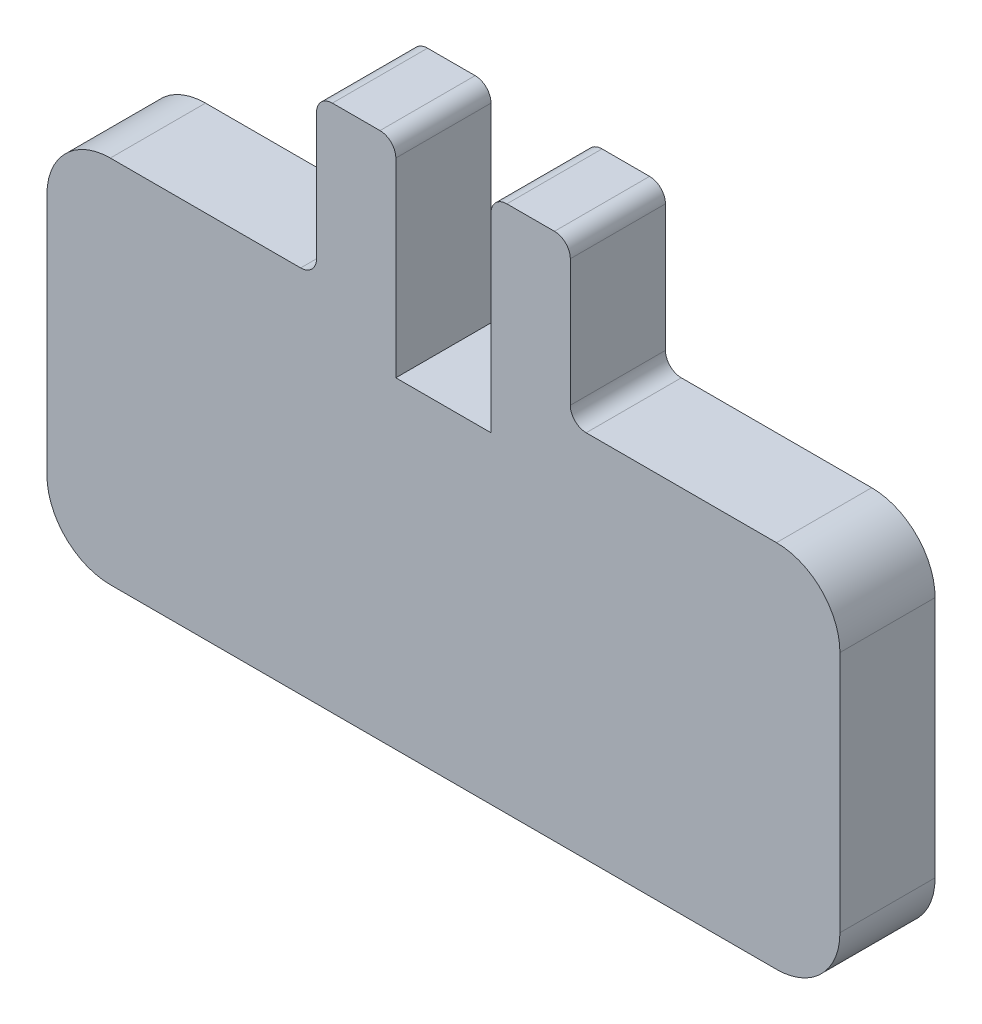
ISO-10303-21;
HEADER;
FILE_DESCRIPTION(('STEP AP214'),'2;1');
FILE_NAME('part.step','',(''),(''),'','','');
FILE_SCHEMA(('AUTOMOTIVE_DESIGN { 1 0 10303 214 1 1 1 1 }'));
ENDSEC;
DATA;
#1=APPLICATION_CONTEXT('core data for automotive mechanical design processes');
#2=APPLICATION_PROTOCOL_DEFINITION('international standard','automotive_design',2000,#1);
#3=PRODUCT_CONTEXT('',#1,'mechanical');
#4=PRODUCT('Part','Part','',(#3));
#5=PRODUCT_RELATED_PRODUCT_CATEGORY('part','',(#4));
#6=PRODUCT_DEFINITION_FORMATION('','',#4);
#7=PRODUCT_DEFINITION_CONTEXT('part definition',#1,'design');
#8=PRODUCT_DEFINITION('design','',#6,#7);
#9=PRODUCT_DEFINITION_SHAPE('','',#8);
#10=(LENGTH_UNIT() NAMED_UNIT(*) SI_UNIT(.MILLI.,.METRE.));
#11=(NAMED_UNIT(*) PLANE_ANGLE_UNIT() SI_UNIT($,.RADIAN.));
#12=(NAMED_UNIT(*) SI_UNIT($,.STERADIAN.) SOLID_ANGLE_UNIT());
#13=UNCERTAINTY_MEASURE_WITH_UNIT(LENGTH_MEASURE(1.E-05),#10,'distance_accuracy_value','');
#14=(GEOMETRIC_REPRESENTATION_CONTEXT(3) GLOBAL_UNCERTAINTY_ASSIGNED_CONTEXT((#13)) GLOBAL_UNIT_ASSIGNED_CONTEXT((#10,
#11,#12)) REPRESENTATION_CONTEXT('',''));
#15=CARTESIAN_POINT('',(0.,0.,0.));
#16=DIRECTION('',(0.,0.,1.));
#17=DIRECTION('',(1.,0.,0.));
#18=AXIS2_PLACEMENT_3D('',#15,#16,#17);
#19=CARTESIAN_POINT('',(0.,0.,6.));
#20=DIRECTION('',(1.,0.,0.));
#21=DIRECTION('',(0.,1.,0.));
#22=AXIS2_PLACEMENT_3D('',#19,#20,#21);
#23=PLANE('',#22);
#24=DIRECTION('',(0.,-1.,0.));
#25=VECTOR('',#24,1.);
#26=CARTESIAN_POINT('',(0.,0.,6.));
#27=LINE('',#26,#25);
#28=CARTESIAN_POINT('',(0.,19.3,6.));
#29=VERTEX_POINT('',#28);
#30=CARTESIAN_POINT('',(0.,4.,6.));
#31=VERTEX_POINT('',#30);
#32=EDGE_CURVE('E216',#29,#31,#27,.T.);
#33=ORIENTED_EDGE('',*,*,#32,.F.);
#34=DIRECTION('',(0.,0.,1.));
#35=VECTOR('',#34,1.);
#36=CARTESIAN_POINT('',(0.,19.3,6.));
#37=LINE('',#36,#35);
#38=CARTESIAN_POINT('',(0.,19.3,0.));
#39=VERTEX_POINT('',#38);
#40=EDGE_CURVE('E269',#29,#39,#37,.F.);
#41=ORIENTED_EDGE('',*,*,#40,.T.);
#42=DIRECTION('',(0.,-1.,0.));
#43=VECTOR('',#42,1.);
#44=CARTESIAN_POINT('',(0.,0.,0.));
#45=LINE('',#44,#43);
#46=CARTESIAN_POINT('',(0.,4.,0.));
#47=VERTEX_POINT('',#46);
#48=EDGE_CURVE('E214',#39,#47,#45,.T.);
#49=ORIENTED_EDGE('',*,*,#48,.T.);
#50=DIRECTION('',(0.,0.,-1.));
#51=VECTOR('',#50,1.);
#52=CARTESIAN_POINT('',(0.,4.,6.));
#53=LINE('',#52,#51);
#54=EDGE_CURVE('E267',#47,#31,#53,.F.);
#55=ORIENTED_EDGE('',*,*,#54,.T.);
#56=EDGE_LOOP('',(#33,#41,#49,#55));
#57=FACE_BOUND('',#56,.T.);
#58=ADVANCED_FACE('F33',(#57),#23,.F.);
#59=CARTESIAN_POINT('',(0.,0.,6.));
#60=DIRECTION('',(0.,1.,0.));
#61=DIRECTION('',(0.,0.,1.));
#62=AXIS2_PLACEMENT_3D('',#59,#60,#61);
#63=PLANE('',#62);
#64=DIRECTION('',(1.,0.,0.));
#65=VECTOR('',#64,1.);
#66=CARTESIAN_POINT('',(0.,0.,0.));
#67=LINE('',#66,#65);
#68=CARTESIAN_POINT('',(4.,0.,0.));
#69=VERTEX_POINT('',#68);
#70=CARTESIAN_POINT('',(46.,0.,0.));
#71=VERTEX_POINT('',#70);
#72=EDGE_CURVE('E229',#69,#71,#67,.T.);
#73=ORIENTED_EDGE('',*,*,#72,.T.);
#74=DIRECTION('',(0.,0.,-1.));
#75=VECTOR('',#74,1.);
#76=CARTESIAN_POINT('',(46.,0.,6.));
#77=LINE('',#76,#75);
#78=CARTESIAN_POINT('',(46.,0.,6.));
#79=VERTEX_POINT('',#78);
#80=EDGE_CURVE('E262',#71,#79,#77,.F.);
#81=ORIENTED_EDGE('',*,*,#80,.T.);
#82=DIRECTION('',(1.,0.,0.));
#83=VECTOR('',#82,1.);
#84=CARTESIAN_POINT('',(0.,0.,6.));
#85=LINE('',#84,#83);
#86=CARTESIAN_POINT('',(4.,0.,6.));
#87=VERTEX_POINT('',#86);
#88=EDGE_CURVE('E219',#87,#79,#85,.T.);
#89=ORIENTED_EDGE('',*,*,#88,.F.);
#90=DIRECTION('',(0.,0.,-1.));
#91=VECTOR('',#90,1.);
#92=CARTESIAN_POINT('',(4.,0.,6.));
#93=LINE('',#92,#91);
#94=EDGE_CURVE('E259',#87,#69,#93,.T.);
#95=ORIENTED_EDGE('',*,*,#94,.T.);
#96=EDGE_LOOP('',(#73,#81,#89,#95));
#97=FACE_BOUND('',#96,.T.);
#98=ADVANCED_FACE('F379',(#97),#63,.F.);
#99=CARTESIAN_POINT('',(50.,0.,6.));
#100=DIRECTION('',(-1.,0.,0.));
#101=DIRECTION('',(0.,-1.,0.));
#102=AXIS2_PLACEMENT_3D('',#99,#100,#101);
#103=PLANE('',#102);
#104=DIRECTION('',(0.,1.,0.));
#105=VECTOR('',#104,1.);
#106=CARTESIAN_POINT('',(50.,0.,0.));
#107=LINE('',#106,#105);
#108=CARTESIAN_POINT('',(50.,4.,0.));
#109=VERTEX_POINT('',#108);
#110=CARTESIAN_POINT('',(50.,19.3,0.));
#111=VERTEX_POINT('',#110);
#112=EDGE_CURVE('E220',#109,#111,#107,.T.);
#113=ORIENTED_EDGE('',*,*,#112,.T.);
#114=DIRECTION('',(0.,0.,1.));
#115=VECTOR('',#114,1.);
#116=CARTESIAN_POINT('',(50.,19.3,6.));
#117=LINE('',#116,#115);
#118=CARTESIAN_POINT('',(50.,19.3,6.));
#119=VERTEX_POINT('',#118);
#120=EDGE_CURVE('E236',#111,#119,#117,.T.);
#121=ORIENTED_EDGE('',*,*,#120,.T.);
#122=DIRECTION('',(0.,1.,0.));
#123=VECTOR('',#122,1.);
#124=CARTESIAN_POINT('',(50.,0.,6.));
#125=LINE('',#124,#123);
#126=CARTESIAN_POINT('',(50.,4.,6.));
#127=VERTEX_POINT('',#126);
#128=EDGE_CURVE('E223',#127,#119,#125,.T.);
#129=ORIENTED_EDGE('',*,*,#128,.F.);
#130=DIRECTION('',(0.,0.,-1.));
#131=VECTOR('',#130,1.);
#132=CARTESIAN_POINT('',(50.,4.,6.));
#133=LINE('',#132,#131);
#134=EDGE_CURVE('E226',#127,#109,#133,.T.);
#135=ORIENTED_EDGE('',*,*,#134,.T.);
#136=EDGE_LOOP('',(#113,#121,#129,#135));
#137=FACE_BOUND('',#136,.T.);
#138=ADVANCED_FACE('F371',(#137),#103,.F.);
#139=CARTESIAN_POINT('',(0.,0.,6.));
#140=DIRECTION('',(0.,0.,-1.));
#141=DIRECTION('',(-1.,0.,0.));
#142=AXIS2_PLACEMENT_3D('',#139,#140,#141);
#143=PLANE('',#142);
#144=DIRECTION('',(0.,-1.,0.));
#145=VECTOR('',#144,1.);
#146=CARTESIAN_POINT('',(33.,44.,6.));
#147=LINE('',#146,#145);
#148=CARTESIAN_POINT('',(33.,32.3,6.));
#149=VERTEX_POINT('',#148);
#150=CARTESIAN_POINT('',(33.,24.3,6.));
#151=VERTEX_POINT('',#150);
#152=EDGE_CURVE('E346',#149,#151,#147,.T.);
#153=ORIENTED_EDGE('',*,*,#152,.F.);
#154=CARTESIAN_POINT('',(32.,32.3,6.));
#155=DIRECTION('',(0.,0.,-1.));
#156=DIRECTION('',(-1.,0.,0.));
#157=AXIS2_PLACEMENT_3D('',#154,#155,#156);
#158=CIRCLE('',#157,1.);
#159=CARTESIAN_POINT('',(32.,33.3,6.));
#160=VERTEX_POINT('',#159);
#161=EDGE_CURVE('E292',#149,#160,#158,.F.);
#162=ORIENTED_EDGE('',*,*,#161,.T.);
#163=DIRECTION('',(1.,0.,0.));
#164=VECTOR('',#163,1.);
#165=CARTESIAN_POINT('',(28.,33.3,6.));
#166=LINE('',#165,#164);
#167=CARTESIAN_POINT('',(29.,33.3,6.));
#168=VERTEX_POINT('',#167);
#169=EDGE_CURVE('E609',#168,#160,#166,.T.);
#170=ORIENTED_EDGE('',*,*,#169,.F.);
#171=CARTESIAN_POINT('',(29.,32.3,6.));
#172=DIRECTION('',(0.,0.,-1.));
#173=DIRECTION('',(-1.,0.,0.));
#174=AXIS2_PLACEMENT_3D('',#171,#172,#173);
#175=CIRCLE('',#174,1.);
#176=CARTESIAN_POINT('',(28.,32.3,6.));
#177=VERTEX_POINT('',#176);
#178=EDGE_CURVE('E290',#168,#177,#175,.F.);
#179=ORIENTED_EDGE('',*,*,#178,.T.);
#180=DIRECTION('',(0.,1.,0.));
#181=VECTOR('',#180,1.);
#182=CARTESIAN_POINT('',(28.,44.,6.));
#183=LINE('',#182,#181);
#184=CARTESIAN_POINT('',(28.,20.3,6.));
#185=VERTEX_POINT('',#184);
#186=EDGE_CURVE('E190',#185,#177,#183,.T.);
#187=ORIENTED_EDGE('',*,*,#186,.F.);
#188=DIRECTION('',(1.,0.,0.));
#189=VECTOR('',#188,1.);
#190=CARTESIAN_POINT('',(22.,20.3,6.));
#191=LINE('',#190,#189);
#192=CARTESIAN_POINT('',(22.,20.3,6.));
#193=VERTEX_POINT('',#192);
#194=EDGE_CURVE('E210',#193,#185,#191,.T.);
#195=ORIENTED_EDGE('',*,*,#194,.F.);
#196=DIRECTION('',(0.,-1.,0.));
#197=VECTOR('',#196,1.);
#198=CARTESIAN_POINT('',(22.,44.,6.));
#199=LINE('',#198,#197);
#200=CARTESIAN_POINT('',(22.,32.3,6.));
#201=VERTEX_POINT('',#200);
#202=EDGE_CURVE('E196',#201,#193,#199,.T.);
#203=ORIENTED_EDGE('',*,*,#202,.F.);
#204=CARTESIAN_POINT('',(21.,32.3,6.));
#205=DIRECTION('',(0.,0.,-1.));
#206=DIRECTION('',(-1.,0.,0.));
#207=AXIS2_PLACEMENT_3D('',#204,#205,#206);
#208=CIRCLE('',#207,1.);
#209=CARTESIAN_POINT('',(21.,33.3,6.));
#210=VERTEX_POINT('',#209);
#211=EDGE_CURVE('E288',#201,#210,#208,.F.);
#212=ORIENTED_EDGE('',*,*,#211,.T.);
#213=DIRECTION('',(1.,0.,0.));
#214=VECTOR('',#213,1.);
#215=CARTESIAN_POINT('',(17.,33.3,6.));
#216=LINE('',#215,#214);
#217=CARTESIAN_POINT('',(18.,33.3,6.));
#218=VERTEX_POINT('',#217);
#219=EDGE_CURVE('E605',#218,#210,#216,.T.);
#220=ORIENTED_EDGE('',*,*,#219,.F.);
#221=CARTESIAN_POINT('',(18.,32.3,6.));
#222=DIRECTION('',(0.,0.,-1.));
#223=DIRECTION('',(-1.,0.,0.));
#224=AXIS2_PLACEMENT_3D('',#221,#222,#223);
#225=CIRCLE('',#224,1.);
#226=CARTESIAN_POINT('',(17.,32.3,6.));
#227=VERTEX_POINT('',#226);
#228=EDGE_CURVE('E286',#218,#227,#225,.F.);
#229=ORIENTED_EDGE('',*,*,#228,.T.);
#230=DIRECTION('',(0.,1.,0.));
#231=VECTOR('',#230,1.);
#232=CARTESIAN_POINT('',(17.,44.,6.));
#233=LINE('',#232,#231);
#234=CARTESIAN_POINT('',(17.,24.3,6.));
#235=VERTEX_POINT('',#234);
#236=EDGE_CURVE('E325',#235,#227,#233,.T.);
#237=ORIENTED_EDGE('',*,*,#236,.F.);
#238=CARTESIAN_POINT('',(16.,24.3,6.));
#239=DIRECTION('',(0.,0.,-1.));
#240=DIRECTION('',(-1.,0.,0.));
#241=AXIS2_PLACEMENT_3D('',#238,#239,#240);
#242=CIRCLE('',#241,1.);
#243=CARTESIAN_POINT('',(16.,23.3,6.));
#244=VERTEX_POINT('',#243);
#245=EDGE_CURVE('E41',#235,#244,#242,.T.);
#246=ORIENTED_EDGE('',*,*,#245,.T.);
#247=DIRECTION('',(1.,0.,0.));
#248=VECTOR('',#247,1.);
#249=CARTESIAN_POINT('',(0.,23.3,6.));
#250=LINE('',#249,#248);
#251=CARTESIAN_POINT('',(4.,23.3,6.));
#252=VERTEX_POINT('',#251);
#253=EDGE_CURVE('E323',#252,#244,#250,.T.);
#254=ORIENTED_EDGE('',*,*,#253,.F.);
#255=CARTESIAN_POINT('',(4.,19.3,6.));
#256=DIRECTION('',(0.,0.,-1.));
#257=DIRECTION('',(-1.,0.,0.));
#258=AXIS2_PLACEMENT_3D('',#255,#256,#257);
#259=CIRCLE('',#258,4.);
#260=EDGE_CURVE('E241',#252,#29,#259,.F.);
#261=ORIENTED_EDGE('',*,*,#260,.T.);
#262=ORIENTED_EDGE('',*,*,#32,.T.);
#263=CARTESIAN_POINT('',(4.,4.,6.));
#264=DIRECTION('',(0.,0.,-1.));
#265=DIRECTION('',(-1.,0.,0.));
#266=AXIS2_PLACEMENT_3D('',#263,#264,#265);
#267=CIRCLE('',#266,4.);
#268=EDGE_CURVE('E239',#31,#87,#267,.F.);
#269=ORIENTED_EDGE('',*,*,#268,.T.);
#270=ORIENTED_EDGE('',*,*,#88,.T.);
#271=CARTESIAN_POINT('',(46.,4.,6.));
#272=DIRECTION('',(0.,0.,-1.));
#273=DIRECTION('',(-1.,0.,0.));
#274=AXIS2_PLACEMENT_3D('',#271,#272,#273);
#275=CIRCLE('',#274,4.);
#276=EDGE_CURVE('E243',#79,#127,#275,.F.);
#277=ORIENTED_EDGE('',*,*,#276,.T.);
#278=ORIENTED_EDGE('',*,*,#128,.T.);
#279=CARTESIAN_POINT('',(46.,19.3,6.));
#280=DIRECTION('',(0.,0.,-1.));
#281=DIRECTION('',(-1.,0.,0.));
#282=AXIS2_PLACEMENT_3D('',#279,#280,#281);
#283=CIRCLE('',#282,4.);
#284=CARTESIAN_POINT('',(46.,23.3,6.));
#285=VERTEX_POINT('',#284);
#286=EDGE_CURVE('E245',#119,#285,#283,.F.);
#287=ORIENTED_EDGE('',*,*,#286,.T.);
#288=DIRECTION('',(1.,0.,0.));
#289=VECTOR('',#288,1.);
#290=CARTESIAN_POINT('',(50.,23.3,6.));
#291=LINE('',#290,#289);
#292=CARTESIAN_POINT('',(34.,23.3,6.));
#293=VERTEX_POINT('',#292);
#294=EDGE_CURVE('E349',#293,#285,#291,.T.);
#295=ORIENTED_EDGE('',*,*,#294,.F.);
#296=CARTESIAN_POINT('',(34.,24.3,6.));
#297=DIRECTION('',(0.,0.,-1.));
#298=DIRECTION('',(-1.,0.,0.));
#299=AXIS2_PLACEMENT_3D('',#296,#297,#298);
#300=CIRCLE('',#299,1.);
#301=EDGE_CURVE('E314',#293,#151,#300,.T.);
#302=ORIENTED_EDGE('',*,*,#301,.T.);
#303=EDGE_LOOP('',(#153,#162,#170,#179,#187,#195,#203,#212,#220,#229,#237,#246,#254,#261,#262,
#269,#270,#277,#278,#287,#295,#302));
#304=FACE_BOUND('',#303,.T.);
#305=ADVANCED_FACE('F322',(#304),#143,.F.);
#306=CARTESIAN_POINT('',(0.,0.,0.));
#307=DIRECTION('',(0.,0.,-1.));
#308=DIRECTION('',(-1.,0.,0.));
#309=AXIS2_PLACEMENT_3D('',#306,#307,#308);
#310=PLANE('',#309);
#311=DIRECTION('',(1.,0.,0.));
#312=VECTOR('',#311,1.);
#313=CARTESIAN_POINT('',(28.,33.3,0.));
#314=LINE('',#313,#312);
#315=CARTESIAN_POINT('',(29.,33.3,0.));
#316=VERTEX_POINT('',#315);
#317=CARTESIAN_POINT('',(32.,33.3,0.));
#318=VERTEX_POINT('',#317);
#319=EDGE_CURVE('E607',#316,#318,#314,.T.);
#320=ORIENTED_EDGE('',*,*,#319,.T.);
#321=CARTESIAN_POINT('',(32.,32.3,0.));
#322=DIRECTION('',(0.,0.,-1.));
#323=DIRECTION('',(-1.,0.,0.));
#324=AXIS2_PLACEMENT_3D('',#321,#322,#323);
#325=CIRCLE('',#324,1.);
#326=CARTESIAN_POINT('',(33.,32.3,0.));
#327=VERTEX_POINT('',#326);
#328=EDGE_CURVE('E304',#318,#327,#325,.T.);
#329=ORIENTED_EDGE('',*,*,#328,.T.);
#330=DIRECTION('',(0.,-1.,0.));
#331=VECTOR('',#330,1.);
#332=CARTESIAN_POINT('',(33.,44.,0.));
#333=LINE('',#332,#331);
#334=CARTESIAN_POINT('',(33.,24.3,0.));
#335=VERTEX_POINT('',#334);
#336=EDGE_CURVE('E355',#327,#335,#333,.T.);
#337=ORIENTED_EDGE('',*,*,#336,.T.);
#338=CARTESIAN_POINT('',(34.,24.3,0.));
#339=DIRECTION('',(0.,0.,-1.));
#340=DIRECTION('',(-1.,0.,0.));
#341=AXIS2_PLACEMENT_3D('',#338,#339,#340);
#342=CIRCLE('',#341,1.);
#343=CARTESIAN_POINT('',(34.,23.3,0.));
#344=VERTEX_POINT('',#343);
#345=EDGE_CURVE('E316',#335,#344,#342,.F.);
#346=ORIENTED_EDGE('',*,*,#345,.T.);
#347=DIRECTION('',(1.,0.,0.));
#348=VECTOR('',#347,1.);
#349=CARTESIAN_POINT('',(50.,23.3,0.));
#350=LINE('',#349,#348);
#351=CARTESIAN_POINT('',(46.,23.3,0.));
#352=VERTEX_POINT('',#351);
#353=EDGE_CURVE('E211',#344,#352,#350,.T.);
#354=ORIENTED_EDGE('',*,*,#353,.T.);
#355=CARTESIAN_POINT('',(46.,19.3,0.));
#356=DIRECTION('',(0.,0.,-1.));
#357=DIRECTION('',(-1.,0.,0.));
#358=AXIS2_PLACEMENT_3D('',#355,#356,#357);
#359=CIRCLE('',#358,4.);
#360=EDGE_CURVE('E257',#352,#111,#359,.T.);
#361=ORIENTED_EDGE('',*,*,#360,.T.);
#362=ORIENTED_EDGE('',*,*,#112,.F.);
#363=CARTESIAN_POINT('',(46.,4.,0.));
#364=DIRECTION('',(0.,0.,-1.));
#365=DIRECTION('',(-1.,0.,0.));
#366=AXIS2_PLACEMENT_3D('',#363,#364,#365);
#367=CIRCLE('',#366,4.);
#368=EDGE_CURVE('E255',#109,#71,#367,.T.);
#369=ORIENTED_EDGE('',*,*,#368,.T.);
#370=ORIENTED_EDGE('',*,*,#72,.F.);
#371=CARTESIAN_POINT('',(4.,4.,0.));
#372=DIRECTION('',(0.,0.,-1.));
#373=DIRECTION('',(-1.,0.,0.));
#374=AXIS2_PLACEMENT_3D('',#371,#372,#373);
#375=CIRCLE('',#374,4.);
#376=EDGE_CURVE('E251',#69,#47,#375,.T.);
#377=ORIENTED_EDGE('',*,*,#376,.T.);
#378=ORIENTED_EDGE('',*,*,#48,.F.);
#379=CARTESIAN_POINT('',(4.,19.3,0.));
#380=DIRECTION('',(0.,0.,-1.));
#381=DIRECTION('',(-1.,0.,0.));
#382=AXIS2_PLACEMENT_3D('',#379,#380,#381);
#383=CIRCLE('',#382,4.);
#384=CARTESIAN_POINT('',(4.,23.3,0.));
#385=VERTEX_POINT('',#384);
#386=EDGE_CURVE('E253',#39,#385,#383,.T.);
#387=ORIENTED_EDGE('',*,*,#386,.T.);
#388=DIRECTION('',(1.,0.,0.));
#389=VECTOR('',#388,1.);
#390=CARTESIAN_POINT('',(0.,23.3,0.));
#391=LINE('',#390,#389);
#392=CARTESIAN_POINT('',(16.,23.3,0.));
#393=VERTEX_POINT('',#392);
#394=EDGE_CURVE('E342',#385,#393,#391,.T.);
#395=ORIENTED_EDGE('',*,*,#394,.T.);
#396=CARTESIAN_POINT('',(16.,24.3,0.));
#397=DIRECTION('',(0.,0.,-1.));
#398=DIRECTION('',(-1.,0.,0.));
#399=AXIS2_PLACEMENT_3D('',#396,#397,#398);
#400=CIRCLE('',#399,1.);
#401=CARTESIAN_POINT('',(17.,24.3,0.));
#402=VERTEX_POINT('',#401);
#403=EDGE_CURVE('E11',#393,#402,#400,.F.);
#404=ORIENTED_EDGE('',*,*,#403,.T.);
#405=DIRECTION('',(0.,1.,0.));
#406=VECTOR('',#405,1.);
#407=CARTESIAN_POINT('',(17.,44.,0.));
#408=LINE('',#407,#406);
#409=CARTESIAN_POINT('',(17.,32.3,0.));
#410=VERTEX_POINT('',#409);
#411=EDGE_CURVE('E340',#402,#410,#408,.T.);
#412=ORIENTED_EDGE('',*,*,#411,.T.);
#413=CARTESIAN_POINT('',(18.,32.3,0.));
#414=DIRECTION('',(0.,0.,-1.));
#415=DIRECTION('',(-1.,0.,0.));
#416=AXIS2_PLACEMENT_3D('',#413,#414,#415);
#417=CIRCLE('',#416,1.);
#418=CARTESIAN_POINT('',(18.,33.3,0.));
#419=VERTEX_POINT('',#418);
#420=EDGE_CURVE('E299',#410,#419,#417,.T.);
#421=ORIENTED_EDGE('',*,*,#420,.T.);
#422=DIRECTION('',(1.,0.,0.));
#423=VECTOR('',#422,1.);
#424=CARTESIAN_POINT('',(17.,33.3,0.));
#425=LINE('',#424,#423);
#426=CARTESIAN_POINT('',(21.,33.3,0.));
#427=VERTEX_POINT('',#426);
#428=EDGE_CURVE('E334',#419,#427,#425,.T.);
#429=ORIENTED_EDGE('',*,*,#428,.T.);
#430=CARTESIAN_POINT('',(21.,32.3,0.));
#431=DIRECTION('',(0.,0.,-1.));
#432=DIRECTION('',(-1.,0.,0.));
#433=AXIS2_PLACEMENT_3D('',#430,#431,#432);
#434=CIRCLE('',#433,1.);
#435=CARTESIAN_POINT('',(22.,32.3,0.));
#436=VERTEX_POINT('',#435);
#437=EDGE_CURVE('E56',#427,#436,#434,.T.);
#438=ORIENTED_EDGE('',*,*,#437,.T.);
#439=DIRECTION('',(0.,-1.,0.));
#440=VECTOR('',#439,1.);
#441=CARTESIAN_POINT('',(22.,44.,0.));
#442=LINE('',#441,#440);
#443=CARTESIAN_POINT('',(22.,20.3,0.));
#444=VERTEX_POINT('',#443);
#445=EDGE_CURVE('E181',#436,#444,#442,.T.);
#446=ORIENTED_EDGE('',*,*,#445,.T.);
#447=DIRECTION('',(1.,0.,0.));
#448=VECTOR('',#447,1.);
#449=CARTESIAN_POINT('',(22.,20.3,0.));
#450=LINE('',#449,#448);
#451=CARTESIAN_POINT('',(28.,20.3,0.));
#452=VERTEX_POINT('',#451);
#453=EDGE_CURVE('E186',#444,#452,#450,.T.);
#454=ORIENTED_EDGE('',*,*,#453,.T.);
#455=DIRECTION('',(0.,1.,0.));
#456=VECTOR('',#455,1.);
#457=CARTESIAN_POINT('',(28.,44.,0.));
#458=LINE('',#457,#456);
#459=CARTESIAN_POINT('',(28.,32.3,0.));
#460=VERTEX_POINT('',#459);
#461=EDGE_CURVE('E201',#452,#460,#458,.T.);
#462=ORIENTED_EDGE('',*,*,#461,.T.);
#463=CARTESIAN_POINT('',(29.,32.3,0.));
#464=DIRECTION('',(0.,0.,-1.));
#465=DIRECTION('',(-1.,0.,0.));
#466=AXIS2_PLACEMENT_3D('',#463,#464,#465);
#467=CIRCLE('',#466,1.);
#468=EDGE_CURVE('E302',#460,#316,#467,.T.);
#469=ORIENTED_EDGE('',*,*,#468,.T.);
#470=EDGE_LOOP('',(#320,#329,#337,#346,#354,#361,#362,#369,#370,#377,#378,#387,#395,#404,#412,
#421,#429,#438,#446,#454,#462,#469));
#471=FACE_BOUND('',#470,.T.);
#472=ADVANCED_FACE('F184',(#471),#310,.T.);
#473=CARTESIAN_POINT('',(22.,44.,0.));
#474=DIRECTION('',(-1.,0.,0.));
#475=DIRECTION('',(0.,-1.,0.));
#476=AXIS2_PLACEMENT_3D('',#473,#474,#475);
#477=PLANE('',#476);
#478=ORIENTED_EDGE('',*,*,#445,.F.);
#479=DIRECTION('',(0.,0.,1.));
#480=VECTOR('',#479,1.);
#481=CARTESIAN_POINT('',(22.,32.3,0.));
#482=LINE('',#481,#480);
#483=EDGE_CURVE('E307',#436,#201,#482,.T.);
#484=ORIENTED_EDGE('',*,*,#483,.T.);
#485=ORIENTED_EDGE('',*,*,#202,.T.);
#486=DIRECTION('',(0.,0.,1.));
#487=VECTOR('',#486,1.);
#488=CARTESIAN_POINT('',(22.,20.3,0.));
#489=LINE('',#488,#487);
#490=EDGE_CURVE('E193',#444,#193,#489,.T.);
#491=ORIENTED_EDGE('',*,*,#490,.F.);
#492=EDGE_LOOP('',(#478,#484,#485,#491));
#493=FACE_BOUND('',#492,.T.);
#494=ADVANCED_FACE('F194',(#493),#477,.F.);
#495=CARTESIAN_POINT('',(28.,44.,0.));
#496=DIRECTION('',(1.,0.,0.));
#497=DIRECTION('',(0.,1.,0.));
#498=AXIS2_PLACEMENT_3D('',#495,#496,#497);
#499=PLANE('',#498);
#500=ORIENTED_EDGE('',*,*,#186,.T.);
#501=DIRECTION('',(0.,0.,1.));
#502=VECTOR('',#501,1.);
#503=CARTESIAN_POINT('',(28.,32.3,0.));
#504=LINE('',#503,#502);
#505=EDGE_CURVE('E48',#177,#460,#504,.F.);
#506=ORIENTED_EDGE('',*,*,#505,.T.);
#507=ORIENTED_EDGE('',*,*,#461,.F.);
#508=DIRECTION('',(0.,0.,1.));
#509=VECTOR('',#508,1.);
#510=CARTESIAN_POINT('',(28.,20.3,0.));
#511=LINE('',#510,#509);
#512=EDGE_CURVE('E200',#452,#185,#511,.T.);
#513=ORIENTED_EDGE('',*,*,#512,.T.);
#514=EDGE_LOOP('',(#500,#506,#507,#513));
#515=FACE_BOUND('',#514,.T.);
#516=ADVANCED_FACE('F437',(#515),#499,.F.);
#517=CARTESIAN_POINT('',(22.,20.3,0.));
#518=DIRECTION('',(0.,-1.,0.));
#519=DIRECTION('',(0.,0.,-1.));
#520=AXIS2_PLACEMENT_3D('',#517,#518,#519);
#521=PLANE('',#520);
#522=ORIENTED_EDGE('',*,*,#194,.T.);
#523=ORIENTED_EDGE('',*,*,#512,.F.);
#524=ORIENTED_EDGE('',*,*,#453,.F.);
#525=ORIENTED_EDGE('',*,*,#490,.T.);
#526=EDGE_LOOP('',(#522,#523,#524,#525));
#527=FACE_BOUND('',#526,.T.);
#528=ADVANCED_FACE('F204',(#527),#521,.F.);
#529=CARTESIAN_POINT('',(50.,23.3,0.));
#530=DIRECTION('',(0.,-1.,0.));
#531=DIRECTION('',(1.,0.,0.));
#532=AXIS2_PLACEMENT_3D('',#529,#530,#531);
#533=PLANE('',#532);
#534=ORIENTED_EDGE('',*,*,#353,.F.);
#535=DIRECTION('',(0.,0.,1.));
#536=VECTOR('',#535,1.);
#537=CARTESIAN_POINT('',(34.,23.3,6.));
#538=LINE('',#537,#536);
#539=EDGE_CURVE('E271',#344,#293,#538,.T.);
#540=ORIENTED_EDGE('',*,*,#539,.T.);
#541=ORIENTED_EDGE('',*,*,#294,.T.);
#542=DIRECTION('',(0.,0.,1.));
#543=VECTOR('',#542,1.);
#544=CARTESIAN_POINT('',(46.,23.3,0.));
#545=LINE('',#544,#543);
#546=EDGE_CURVE('E248',#285,#352,#545,.F.);
#547=ORIENTED_EDGE('',*,*,#546,.T.);
#548=EDGE_LOOP('',(#534,#540,#541,#547));
#549=FACE_BOUND('',#548,.T.);
#550=ADVANCED_FACE('F361',(#549),#533,.F.);
#551=CARTESIAN_POINT('',(33.,44.,0.));
#552=DIRECTION('',(-1.,0.,0.));
#553=DIRECTION('',(0.,0.,1.));
#554=AXIS2_PLACEMENT_3D('',#551,#552,#553);
#555=PLANE('',#554);
#556=ORIENTED_EDGE('',*,*,#152,.T.);
#557=DIRECTION('',(0.,0.,1.));
#558=VECTOR('',#557,1.);
#559=CARTESIAN_POINT('',(33.,24.3,0.));
#560=LINE('',#559,#558);
#561=EDGE_CURVE('E277',#151,#335,#560,.F.);
#562=ORIENTED_EDGE('',*,*,#561,.T.);
#563=ORIENTED_EDGE('',*,*,#336,.F.);
#564=DIRECTION('',(0.,0.,1.));
#565=VECTOR('',#564,1.);
#566=CARTESIAN_POINT('',(33.,32.3,0.));
#567=LINE('',#566,#565);
#568=EDGE_CURVE('E274',#327,#149,#567,.T.);
#569=ORIENTED_EDGE('',*,*,#568,.T.);
#570=EDGE_LOOP('',(#556,#562,#563,#569));
#571=FACE_BOUND('',#570,.T.);
#572=ADVANCED_FACE('F429',(#571),#555,.F.);
#573=CARTESIAN_POINT('',(17.,44.,0.));
#574=DIRECTION('',(1.,0.,0.));
#575=DIRECTION('',(0.,1.,0.));
#576=AXIS2_PLACEMENT_3D('',#573,#574,#575);
#577=PLANE('',#576);
#578=ORIENTED_EDGE('',*,*,#411,.F.);
#579=DIRECTION('',(0.,0.,1.));
#580=VECTOR('',#579,1.);
#581=CARTESIAN_POINT('',(17.,24.3,6.));
#582=LINE('',#581,#580);
#583=EDGE_CURVE('E281',#402,#235,#582,.T.);
#584=ORIENTED_EDGE('',*,*,#583,.T.);
#585=ORIENTED_EDGE('',*,*,#236,.T.);
#586=DIRECTION('',(0.,0.,1.));
#587=VECTOR('',#586,1.);
#588=CARTESIAN_POINT('',(17.,32.3,0.));
#589=LINE('',#588,#587);
#590=EDGE_CURVE('E279',#227,#410,#589,.F.);
#591=ORIENTED_EDGE('',*,*,#590,.T.);
#592=EDGE_LOOP('',(#578,#584,#585,#591));
#593=FACE_BOUND('',#592,.T.);
#594=ADVANCED_FACE('F344',(#593),#577,.F.);
#595=CARTESIAN_POINT('',(0.,23.3,0.));
#596=DIRECTION('',(0.,-1.,0.));
#597=DIRECTION('',(0.,0.,-1.));
#598=AXIS2_PLACEMENT_3D('',#595,#596,#597);
#599=PLANE('',#598);
#600=ORIENTED_EDGE('',*,*,#253,.T.);
#601=DIRECTION('',(0.,0.,1.));
#602=VECTOR('',#601,1.);
#603=CARTESIAN_POINT('',(16.,23.3,0.));
#604=LINE('',#603,#602);
#605=EDGE_CURVE('E284',#244,#393,#604,.F.);
#606=ORIENTED_EDGE('',*,*,#605,.T.);
#607=ORIENTED_EDGE('',*,*,#394,.F.);
#608=DIRECTION('',(0.,0.,1.));
#609=VECTOR('',#608,1.);
#610=CARTESIAN_POINT('',(4.,23.3,0.));
#611=LINE('',#610,#609);
#612=EDGE_CURVE('E264',#385,#252,#611,.T.);
#613=ORIENTED_EDGE('',*,*,#612,.T.);
#614=EDGE_LOOP('',(#600,#606,#607,#613));
#615=FACE_BOUND('',#614,.T.);
#616=ADVANCED_FACE('F330',(#615),#599,.F.);
#617=CARTESIAN_POINT('',(17.,33.3,0.));
#618=DIRECTION('',(0.,-1.,0.));
#619=DIRECTION('',(0.,0.,-1.));
#620=AXIS2_PLACEMENT_3D('',#617,#618,#619);
#621=PLANE('',#620);
#622=ORIENTED_EDGE('',*,*,#219,.T.);
#623=DIRECTION('',(0.,0.,1.));
#624=VECTOR('',#623,1.);
#625=CARTESIAN_POINT('',(21.,33.3,0.));
#626=LINE('',#625,#624);
#627=EDGE_CURVE('E312',#210,#427,#626,.F.);
#628=ORIENTED_EDGE('',*,*,#627,.T.);
#629=ORIENTED_EDGE('',*,*,#428,.F.);
#630=DIRECTION('',(0.,0.,1.));
#631=VECTOR('',#630,1.);
#632=CARTESIAN_POINT('',(18.,33.3,0.));
#633=LINE('',#632,#631);
#634=EDGE_CURVE('E309',#419,#218,#633,.T.);
#635=ORIENTED_EDGE('',*,*,#634,.T.);
#636=EDGE_LOOP('',(#622,#628,#629,#635));
#637=FACE_BOUND('',#636,.T.);
#638=ADVANCED_FACE('F417',(#637),#621,.F.);
#639=CARTESIAN_POINT('',(28.,33.3,0.));
#640=DIRECTION('',(0.,-1.,0.));
#641=DIRECTION('',(0.,0.,-1.));
#642=AXIS2_PLACEMENT_3D('',#639,#640,#641);
#643=PLANE('',#642);
#644=ORIENTED_EDGE('',*,*,#169,.T.);
#645=DIRECTION('',(0.,0.,1.));
#646=VECTOR('',#645,1.);
#647=CARTESIAN_POINT('',(32.,33.3,0.));
#648=LINE('',#647,#646);
#649=EDGE_CURVE('E297',#160,#318,#648,.F.);
#650=ORIENTED_EDGE('',*,*,#649,.T.);
#651=ORIENTED_EDGE('',*,*,#319,.F.);
#652=DIRECTION('',(0.,0.,1.));
#653=VECTOR('',#652,1.);
#654=CARTESIAN_POINT('',(29.,33.3,0.));
#655=LINE('',#654,#653);
#656=EDGE_CURVE('E294',#316,#168,#655,.T.);
#657=ORIENTED_EDGE('',*,*,#656,.T.);
#658=EDGE_LOOP('',(#644,#650,#651,#657));
#659=FACE_BOUND('',#658,.T.);
#660=ADVANCED_FACE('F412',(#659),#643,.F.);
#661=CARTESIAN_POINT('',(46.,19.3,6.));
#662=DIRECTION('',(0.,0.,1.));
#663=DIRECTION('',(1.,0.,0.));
#664=AXIS2_PLACEMENT_3D('',#661,#662,#663);
#665=CYLINDRICAL_SURFACE('',#664,4.);
#666=ORIENTED_EDGE('',*,*,#360,.F.);
#667=ORIENTED_EDGE('',*,*,#546,.F.);
#668=ORIENTED_EDGE('',*,*,#286,.F.);
#669=ORIENTED_EDGE('',*,*,#120,.F.);
#670=EDGE_LOOP('',(#666,#667,#668,#669));
#671=FACE_BOUND('',#670,.T.);
#672=ADVANCED_FACE('F368',(#671),#665,.T.);
#673=CARTESIAN_POINT('',(46.,4.,6.));
#674=DIRECTION('',(0.,0.,-1.));
#675=DIRECTION('',(-1.,0.,0.));
#676=AXIS2_PLACEMENT_3D('',#673,#674,#675);
#677=CYLINDRICAL_SURFACE('',#676,4.);
#678=ORIENTED_EDGE('',*,*,#276,.F.);
#679=ORIENTED_EDGE('',*,*,#80,.F.);
#680=ORIENTED_EDGE('',*,*,#368,.F.);
#681=ORIENTED_EDGE('',*,*,#134,.F.);
#682=EDGE_LOOP('',(#678,#679,#680,#681));
#683=FACE_BOUND('',#682,.T.);
#684=ADVANCED_FACE('F375',(#683),#677,.T.);
#685=CARTESIAN_POINT('',(4.,19.3,0.));
#686=DIRECTION('',(0.,0.,1.));
#687=DIRECTION('',(1.,0.,0.));
#688=AXIS2_PLACEMENT_3D('',#685,#686,#687);
#689=CYLINDRICAL_SURFACE('',#688,4.);
#690=ORIENTED_EDGE('',*,*,#386,.F.);
#691=ORIENTED_EDGE('',*,*,#40,.F.);
#692=ORIENTED_EDGE('',*,*,#260,.F.);
#693=ORIENTED_EDGE('',*,*,#612,.F.);
#694=EDGE_LOOP('',(#690,#691,#692,#693));
#695=FACE_BOUND('',#694,.T.);
#696=ADVANCED_FACE('F392',(#695),#689,.T.);
#697=CARTESIAN_POINT('',(4.,4.,6.));
#698=DIRECTION('',(0.,0.,-1.));
#699=DIRECTION('',(-1.,0.,0.));
#700=AXIS2_PLACEMENT_3D('',#697,#698,#699);
#701=CYLINDRICAL_SURFACE('',#700,4.);
#702=ORIENTED_EDGE('',*,*,#268,.F.);
#703=ORIENTED_EDGE('',*,*,#54,.F.);
#704=ORIENTED_EDGE('',*,*,#376,.F.);
#705=ORIENTED_EDGE('',*,*,#94,.F.);
#706=EDGE_LOOP('',(#702,#703,#704,#705));
#707=FACE_BOUND('',#706,.T.);
#708=ADVANCED_FACE('F384',(#707),#701,.T.);
#709=CARTESIAN_POINT('',(34.,24.3,0.));
#710=DIRECTION('',(0.,0.,-1.));
#711=DIRECTION('',(-1.,0.,0.));
#712=AXIS2_PLACEMENT_3D('',#709,#710,#711);
#713=CYLINDRICAL_SURFACE('',#712,1.);
#714=ORIENTED_EDGE('',*,*,#345,.F.);
#715=ORIENTED_EDGE('',*,*,#561,.F.);
#716=ORIENTED_EDGE('',*,*,#301,.F.);
#717=ORIENTED_EDGE('',*,*,#539,.F.);
#718=EDGE_LOOP('',(#714,#715,#716,#717));
#719=FACE_BOUND('',#718,.T.);
#720=ADVANCED_FACE('F399',(#719),#713,.F.);
#721=CARTESIAN_POINT('',(16.,24.3,0.));
#722=DIRECTION('',(0.,0.,-1.));
#723=DIRECTION('',(-1.,0.,0.));
#724=AXIS2_PLACEMENT_3D('',#721,#722,#723);
#725=CYLINDRICAL_SURFACE('',#724,1.);
#726=ORIENTED_EDGE('',*,*,#403,.F.);
#727=ORIENTED_EDGE('',*,*,#605,.F.);
#728=ORIENTED_EDGE('',*,*,#245,.F.);
#729=ORIENTED_EDGE('',*,*,#583,.F.);
#730=EDGE_LOOP('',(#726,#727,#728,#729));
#731=FACE_BOUND('',#730,.T.);
#732=ADVANCED_FACE('F337',(#731),#725,.F.);
#733=CARTESIAN_POINT('',(32.,32.3,0.));
#734=DIRECTION('',(0.,0.,1.));
#735=DIRECTION('',(1.,0.,0.));
#736=AXIS2_PLACEMENT_3D('',#733,#734,#735);
#737=CYLINDRICAL_SURFACE('',#736,1.);
#738=ORIENTED_EDGE('',*,*,#328,.F.);
#739=ORIENTED_EDGE('',*,*,#649,.F.);
#740=ORIENTED_EDGE('',*,*,#161,.F.);
#741=ORIENTED_EDGE('',*,*,#568,.F.);
#742=EDGE_LOOP('',(#738,#739,#740,#741));
#743=FACE_BOUND('',#742,.T.);
#744=ADVANCED_FACE('F557',(#743),#737,.T.);
#745=CARTESIAN_POINT('',(29.,32.3,0.));
#746=DIRECTION('',(0.,0.,1.));
#747=DIRECTION('',(1.,0.,0.));
#748=AXIS2_PLACEMENT_3D('',#745,#746,#747);
#749=CYLINDRICAL_SURFACE('',#748,1.);
#750=ORIENTED_EDGE('',*,*,#468,.F.);
#751=ORIENTED_EDGE('',*,*,#505,.F.);
#752=ORIENTED_EDGE('',*,*,#178,.F.);
#753=ORIENTED_EDGE('',*,*,#656,.F.);
#754=EDGE_LOOP('',(#750,#751,#752,#753));
#755=FACE_BOUND('',#754,.T.);
#756=ADVANCED_FACE('F564',(#755),#749,.T.);
#757=CARTESIAN_POINT('',(21.,32.3,0.));
#758=DIRECTION('',(0.,0.,1.));
#759=DIRECTION('',(1.,0.,0.));
#760=AXIS2_PLACEMENT_3D('',#757,#758,#759);
#761=CYLINDRICAL_SURFACE('',#760,1.);
#762=ORIENTED_EDGE('',*,*,#437,.F.);
#763=ORIENTED_EDGE('',*,*,#627,.F.);
#764=ORIENTED_EDGE('',*,*,#211,.F.);
#765=ORIENTED_EDGE('',*,*,#483,.F.);
#766=EDGE_LOOP('',(#762,#763,#764,#765));
#767=FACE_BOUND('',#766,.T.);
#768=ADVANCED_FACE('F572',(#767),#761,.T.);
#769=CARTESIAN_POINT('',(18.,32.3,0.));
#770=DIRECTION('',(0.,0.,1.));
#771=DIRECTION('',(1.,0.,0.));
#772=AXIS2_PLACEMENT_3D('',#769,#770,#771);
#773=CYLINDRICAL_SURFACE('',#772,1.);
#774=ORIENTED_EDGE('',*,*,#420,.F.);
#775=ORIENTED_EDGE('',*,*,#590,.F.);
#776=ORIENTED_EDGE('',*,*,#228,.F.);
#777=ORIENTED_EDGE('',*,*,#634,.F.);
#778=EDGE_LOOP('',(#774,#775,#776,#777));
#779=FACE_BOUND('',#778,.T.);
#780=ADVANCED_FACE('F35',(#779),#773,.T.);
#781=CLOSED_SHELL('',(#58,#98,#138,#305,#472,#494,#516,#528,#550,#572,#594,#616,#638,#660,#672,
#684,#696,#708,#720,#732,#744,#756,#768,#780));
#782=MANIFOLD_SOLID_BREP('B2',#781);
#783=ADVANCED_BREP_SHAPE_REPRESENTATION('',(#18,#782),#14);
#784=SHAPE_DEFINITION_REPRESENTATION(#9,#783);
ENDSEC;
END-ISO-10303-21;
